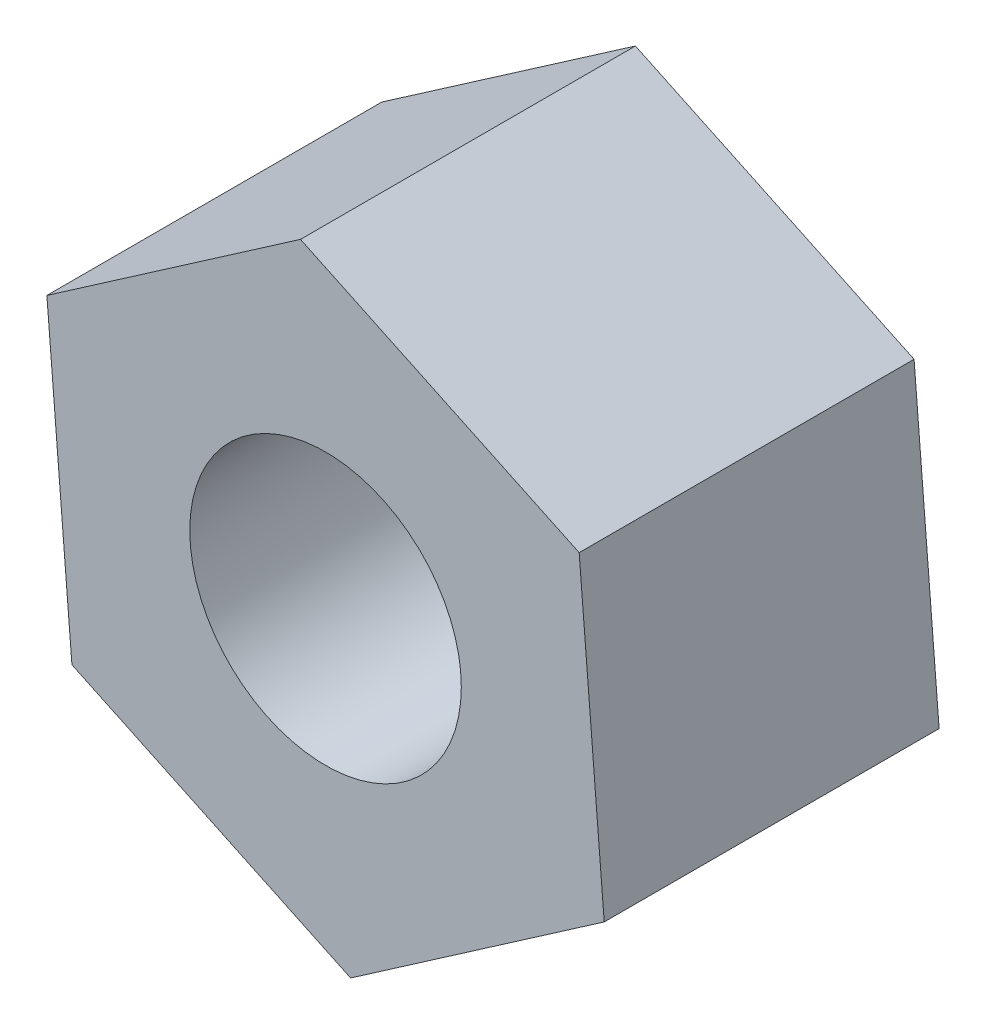
ISO-10303-21;
HEADER;
FILE_DESCRIPTION(('STEP AP214'),'2;1');
FILE_NAME('part.step','',(''),(''),'','','');
FILE_SCHEMA(('AUTOMOTIVE_DESIGN { 1 0 10303 214 1 1 1 1 }'));
ENDSEC;
DATA;
#1=APPLICATION_CONTEXT('core data for automotive mechanical design processes');
#2=APPLICATION_PROTOCOL_DEFINITION('international standard','automotive_design',2000,#1);
#3=PRODUCT_CONTEXT('',#1,'mechanical');
#4=PRODUCT('Part','Part','',(#3));
#5=PRODUCT_RELATED_PRODUCT_CATEGORY('part','',(#4));
#6=PRODUCT_DEFINITION_FORMATION('','',#4);
#7=PRODUCT_DEFINITION_CONTEXT('part definition',#1,'design');
#8=PRODUCT_DEFINITION('design','',#6,#7);
#9=PRODUCT_DEFINITION_SHAPE('','',#8);
#10=(LENGTH_UNIT() NAMED_UNIT(*) SI_UNIT(.MILLI.,.METRE.));
#11=(NAMED_UNIT(*) PLANE_ANGLE_UNIT() SI_UNIT($,.RADIAN.));
#12=(NAMED_UNIT(*) SI_UNIT($,.STERADIAN.) SOLID_ANGLE_UNIT());
#13=UNCERTAINTY_MEASURE_WITH_UNIT(LENGTH_MEASURE(1.E-05),#10,'distance_accuracy_value','');
#14=(GEOMETRIC_REPRESENTATION_CONTEXT(3) GLOBAL_UNCERTAINTY_ASSIGNED_CONTEXT((#13)) GLOBAL_UNIT_ASSIGNED_CONTEXT((#10,
#11,#12)) REPRESENTATION_CONTEXT('',''));
#15=CARTESIAN_POINT('',(0.,0.,0.));
#16=DIRECTION('',(0.,0.,1.));
#17=DIRECTION('',(1.,0.,0.));
#18=AXIS2_PLACEMENT_3D('',#15,#16,#17);
#19=CARTESIAN_POINT('',(0.,0.,3.7));
#20=DIRECTION('',(0.,0.,1.));
#21=DIRECTION('',(1.,0.,0.));
#22=AXIS2_PLACEMENT_3D('',#19,#20,#21);
#23=PLANE('',#22);
#24=DIRECTION('',(-0.903778262593263,0.428000995400599,0.));
#25=VECTOR('',#24,1.);
#26=CARTESIAN_POINT('',(2.80190297485983,1.93718172942163,3.7));
#27=LINE('',#26,#25);
#28=CARTESIAN_POINT('',(2.80190297485983,1.93718172942163,3.7));
#29=VERTEX_POINT('',#28);
#30=CARTESIAN_POINT('',(-0.276697101996294,3.39511001987862,3.7));
#31=VERTEX_POINT('',#30);
#32=EDGE_CURVE('E143',#29,#31,#27,.T.);
#33=ORIENTED_EDGE('',*,*,#32,.T.);
#34=DIRECTION('',(-0.822548866158576,-0.56869443709363,0.));
#35=VECTOR('',#34,1.);
#36=CARTESIAN_POINT('',(-0.276697101996294,3.39511001987862,3.7));
#37=LINE('',#36,#35);
#38=CARTESIAN_POINT('',(-3.07860007685612,1.45792829045698,3.7));
#39=VERTEX_POINT('',#38);
#40=EDGE_CURVE('E101',#31,#39,#37,.T.);
#41=ORIENTED_EDGE('',*,*,#40,.T.);
#42=DIRECTION('',(0.0812293964346863,-0.996695432494228,0.));
#43=VECTOR('',#42,1.);
#44=CARTESIAN_POINT('',(-3.07860007685612,1.45792829045698,3.7));
#45=LINE('',#44,#43);
#46=CARTESIAN_POINT('',(-2.80190297485983,-1.93718172942163,3.7));
#47=VERTEX_POINT('',#46);
#48=EDGE_CURVE('E114',#39,#47,#45,.T.);
#49=ORIENTED_EDGE('',*,*,#48,.T.);
#50=DIRECTION('',(0.903778262593263,-0.428000995400599,0.));
#51=VECTOR('',#50,1.);
#52=CARTESIAN_POINT('',(-2.80190297485983,-1.93718172942163,3.7));
#53=LINE('',#52,#51);
#54=CARTESIAN_POINT('',(0.276697101996293,-3.39511001987862,3.7));
#55=VERTEX_POINT('',#54);
#56=EDGE_CURVE('E108',#47,#55,#53,.T.);
#57=ORIENTED_EDGE('',*,*,#56,.T.);
#58=DIRECTION('',(0.822548866158576,0.56869443709363,0.));
#59=VECTOR('',#58,1.);
#60=CARTESIAN_POINT('',(0.276697101996293,-3.39511001987862,3.7));
#61=LINE('',#60,#59);
#62=CARTESIAN_POINT('',(3.07860007685612,-1.45792829045698,3.7));
#63=VERTEX_POINT('',#62);
#64=EDGE_CURVE('E112',#55,#63,#61,.T.);
#65=ORIENTED_EDGE('',*,*,#64,.T.);
#66=DIRECTION('',(-0.0812293964346861,0.996695432494228,0.));
#67=VECTOR('',#66,1.);
#68=CARTESIAN_POINT('',(3.07860007685612,-1.45792829045698,3.7));
#69=LINE('',#68,#67);
#70=EDGE_CURVE('E64',#63,#29,#69,.T.);
#71=ORIENTED_EDGE('',*,*,#70,.T.);
#72=EDGE_LOOP('',(#33,#41,#49,#57,#65,#71));
#73=FACE_BOUND('',#72,.T.);
#74=CARTESIAN_POINT('',(0.,0.,3.7));
#75=DIRECTION('',(0.,0.,1.));
#76=DIRECTION('',(1.,0.,0.));
#77=AXIS2_PLACEMENT_3D('',#74,#75,#76);
#78=CIRCLE('',#77,1.5);
#79=CARTESIAN_POINT('',(1.5,0.,3.7));
#80=VERTEX_POINT('',#79);
#81=EDGE_CURVE('E136',#80,#80,#78,.T.);
#82=ORIENTED_EDGE('',*,*,#81,.F.);
#83=EDGE_LOOP('',(#82));
#84=FACE_BOUND('',#83,.T.);
#85=ADVANCED_FACE('F47',(#73,#84),#23,.T.);
#86=CARTESIAN_POINT('',(0.,0.,0.));
#87=DIRECTION('',(0.,0.,1.));
#88=DIRECTION('',(1.,0.,0.));
#89=AXIS2_PLACEMENT_3D('',#86,#87,#88);
#90=PLANE('',#89);
#91=DIRECTION('',(-0.903778262593263,0.428000995400599,0.));
#92=VECTOR('',#91,1.);
#93=CARTESIAN_POINT('',(2.80190297485983,1.93718172942163,0.));
#94=LINE('',#93,#92);
#95=CARTESIAN_POINT('',(2.80190297485983,1.93718172942163,0.));
#96=VERTEX_POINT('',#95);
#97=CARTESIAN_POINT('',(-0.276697101996294,3.39511001987862,0.));
#98=VERTEX_POINT('',#97);
#99=EDGE_CURVE('E132',#96,#98,#94,.T.);
#100=ORIENTED_EDGE('',*,*,#99,.F.);
#101=DIRECTION('',(-0.0812293964346861,0.996695432494228,0.));
#102=VECTOR('',#101,1.);
#103=CARTESIAN_POINT('',(3.07860007685612,-1.45792829045698,0.));
#104=LINE('',#103,#102);
#105=CARTESIAN_POINT('',(3.07860007685612,-1.45792829045698,0.));
#106=VERTEX_POINT('',#105);
#107=EDGE_CURVE('E93',#106,#96,#104,.T.);
#108=ORIENTED_EDGE('',*,*,#107,.F.);
#109=DIRECTION('',(0.822548866158576,0.56869443709363,0.));
#110=VECTOR('',#109,1.);
#111=CARTESIAN_POINT('',(0.276697101996293,-3.39511001987862,0.));
#112=LINE('',#111,#110);
#113=CARTESIAN_POINT('',(0.276697101996293,-3.39511001987862,0.));
#114=VERTEX_POINT('',#113);
#115=EDGE_CURVE('E87',#114,#106,#112,.T.);
#116=ORIENTED_EDGE('',*,*,#115,.F.);
#117=DIRECTION('',(0.903778262593263,-0.428000995400599,0.));
#118=VECTOR('',#117,1.);
#119=CARTESIAN_POINT('',(-2.80190297485983,-1.93718172942163,0.));
#120=LINE('',#119,#118);
#121=CARTESIAN_POINT('',(-2.80190297485983,-1.93718172942163,0.));
#122=VERTEX_POINT('',#121);
#123=EDGE_CURVE('E122',#122,#114,#120,.T.);
#124=ORIENTED_EDGE('',*,*,#123,.F.);
#125=DIRECTION('',(0.0812293964346863,-0.996695432494228,0.));
#126=VECTOR('',#125,1.);
#127=CARTESIAN_POINT('',(-3.07860007685612,1.45792829045698,0.));
#128=LINE('',#127,#126);
#129=CARTESIAN_POINT('',(-3.07860007685612,1.45792829045698,0.));
#130=VERTEX_POINT('',#129);
#131=EDGE_CURVE('E138',#130,#122,#128,.T.);
#132=ORIENTED_EDGE('',*,*,#131,.F.);
#133=DIRECTION('',(-0.822548866158576,-0.56869443709363,0.));
#134=VECTOR('',#133,1.);
#135=CARTESIAN_POINT('',(-0.276697101996294,3.39511001987862,0.));
#136=LINE('',#135,#134);
#137=EDGE_CURVE('E135',#98,#130,#136,.T.);
#138=ORIENTED_EDGE('',*,*,#137,.F.);
#139=EDGE_LOOP('',(#100,#108,#116,#124,#132,#138));
#140=FACE_BOUND('',#139,.T.);
#141=CARTESIAN_POINT('',(0.,0.,0.));
#142=DIRECTION('',(0.,0.,1.));
#143=DIRECTION('',(1.,0.,0.));
#144=AXIS2_PLACEMENT_3D('',#141,#142,#143);
#145=CIRCLE('',#144,1.5);
#146=CARTESIAN_POINT('',(1.5,0.,0.));
#147=VERTEX_POINT('',#146);
#148=EDGE_CURVE('E246',#147,#147,#145,.T.);
#149=ORIENTED_EDGE('',*,*,#148,.T.);
#150=EDGE_LOOP('',(#149));
#151=FACE_BOUND('',#150,.T.);
#152=ADVANCED_FACE('F152',(#140,#151),#90,.F.);
#153=CARTESIAN_POINT('',(2.80190297485983,1.93718172942163,3.7));
#154=DIRECTION('',(-0.428000995400598,-0.903778262593263,0.));
#155=DIRECTION('',(0.903778262593263,-0.428000995400598,0.));
#156=AXIS2_PLACEMENT_3D('',#153,#154,#155);
#157=PLANE('',#156);
#158=ORIENTED_EDGE('',*,*,#99,.T.);
#159=DIRECTION('',(0.,0.,-1.));
#160=VECTOR('',#159,1.);
#161=CARTESIAN_POINT('',(-0.276697101996294,3.39511001987862,3.7));
#162=LINE('',#161,#160);
#163=EDGE_CURVE('E11',#31,#98,#162,.T.);
#164=ORIENTED_EDGE('',*,*,#163,.F.);
#165=ORIENTED_EDGE('',*,*,#32,.F.);
#166=DIRECTION('',(0.,0.,-1.));
#167=VECTOR('',#166,1.);
#168=CARTESIAN_POINT('',(2.80190297485983,1.93718172942163,3.7));
#169=LINE('',#168,#167);
#170=EDGE_CURVE('E128',#29,#96,#169,.T.);
#171=ORIENTED_EDGE('',*,*,#170,.T.);
#172=EDGE_LOOP('',(#158,#164,#165,#171));
#173=FACE_BOUND('',#172,.T.);
#174=ADVANCED_FACE('F49',(#173),#157,.F.);
#175=CARTESIAN_POINT('',(-0.276697101996294,3.39511001987862,3.7));
#176=DIRECTION('',(0.56869443709363,-0.822548866158577,0.));
#177=DIRECTION('',(0.822548866158576,0.56869443709363,0.));
#178=AXIS2_PLACEMENT_3D('',#175,#176,#177);
#179=PLANE('',#178);
#180=ORIENTED_EDGE('',*,*,#137,.T.);
#181=DIRECTION('',(0.,0.,-1.));
#182=VECTOR('',#181,1.);
#183=CARTESIAN_POINT('',(-3.07860007685612,1.45792829045698,3.7));
#184=LINE('',#183,#182);
#185=EDGE_CURVE('E56',#39,#130,#184,.T.);
#186=ORIENTED_EDGE('',*,*,#185,.F.);
#187=ORIENTED_EDGE('',*,*,#40,.F.);
#188=ORIENTED_EDGE('',*,*,#163,.T.);
#189=EDGE_LOOP('',(#180,#186,#187,#188));
#190=FACE_BOUND('',#189,.T.);
#191=ADVANCED_FACE('F179',(#190),#179,.F.);
#192=CARTESIAN_POINT('',(-3.07860007685612,1.45792829045698,3.7));
#193=DIRECTION('',(0.996695432494228,0.0812293964346863,0.));
#194=DIRECTION('',(-0.0812293964346863,0.996695432494228,0.));
#195=AXIS2_PLACEMENT_3D('',#192,#193,#194);
#196=PLANE('',#195);
#197=ORIENTED_EDGE('',*,*,#131,.T.);
#198=DIRECTION('',(0.,0.,-1.));
#199=VECTOR('',#198,1.);
#200=CARTESIAN_POINT('',(-2.80190297485983,-1.93718172942163,3.7));
#201=LINE('',#200,#199);
#202=EDGE_CURVE('E123',#47,#122,#201,.T.);
#203=ORIENTED_EDGE('',*,*,#202,.F.);
#204=ORIENTED_EDGE('',*,*,#48,.F.);
#205=ORIENTED_EDGE('',*,*,#185,.T.);
#206=EDGE_LOOP('',(#197,#203,#204,#205));
#207=FACE_BOUND('',#206,.T.);
#208=ADVANCED_FACE('F149',(#207),#196,.F.);
#209=CARTESIAN_POINT('',(-2.80190297485983,-1.93718172942163,3.7));
#210=DIRECTION('',(0.428000995400599,0.903778262593263,0.));
#211=DIRECTION('',(-0.903778262593263,0.428000995400599,0.));
#212=AXIS2_PLACEMENT_3D('',#209,#210,#211);
#213=PLANE('',#212);
#214=ORIENTED_EDGE('',*,*,#123,.T.);
#215=DIRECTION('',(0.,0.,-1.));
#216=VECTOR('',#215,1.);
#217=CARTESIAN_POINT('',(0.276697101996293,-3.39511001987862,3.7));
#218=LINE('',#217,#216);
#219=EDGE_CURVE('E119',#55,#114,#218,.T.);
#220=ORIENTED_EDGE('',*,*,#219,.F.);
#221=ORIENTED_EDGE('',*,*,#56,.F.);
#222=ORIENTED_EDGE('',*,*,#202,.T.);
#223=EDGE_LOOP('',(#214,#220,#221,#222));
#224=FACE_BOUND('',#223,.T.);
#225=ADVANCED_FACE('F120',(#224),#213,.F.);
#226=CARTESIAN_POINT('',(0.276697101996293,-3.39511001987862,3.7));
#227=DIRECTION('',(-0.56869443709363,0.822548866158576,0.));
#228=DIRECTION('',(-0.822548866158576,-0.56869443709363,0.));
#229=AXIS2_PLACEMENT_3D('',#226,#227,#228);
#230=PLANE('',#229);
#231=ORIENTED_EDGE('',*,*,#115,.T.);
#232=DIRECTION('',(0.,0.,-1.));
#233=VECTOR('',#232,1.);
#234=CARTESIAN_POINT('',(3.07860007685612,-1.45792829045698,3.7));
#235=LINE('',#234,#233);
#236=EDGE_CURVE('E124',#63,#106,#235,.T.);
#237=ORIENTED_EDGE('',*,*,#236,.F.);
#238=ORIENTED_EDGE('',*,*,#64,.F.);
#239=ORIENTED_EDGE('',*,*,#219,.T.);
#240=EDGE_LOOP('',(#231,#237,#238,#239));
#241=FACE_BOUND('',#240,.T.);
#242=ADVANCED_FACE('F126',(#241),#230,.F.);
#243=CARTESIAN_POINT('',(3.07860007685612,-1.45792829045698,3.7));
#244=DIRECTION('',(-0.996695432494228,-0.0812293964346861,0.));
#245=DIRECTION('',(0.0812293964346861,-0.996695432494228,0.));
#246=AXIS2_PLACEMENT_3D('',#243,#244,#245);
#247=PLANE('',#246);
#248=ORIENTED_EDGE('',*,*,#107,.T.);
#249=ORIENTED_EDGE('',*,*,#170,.F.);
#250=ORIENTED_EDGE('',*,*,#70,.F.);
#251=ORIENTED_EDGE('',*,*,#236,.T.);
#252=EDGE_LOOP('',(#248,#249,#250,#251));
#253=FACE_BOUND('',#252,.T.);
#254=ADVANCED_FACE('F157',(#253),#247,.F.);
#255=CARTESIAN_POINT('',(0.,0.,3.7));
#256=DIRECTION('',(0.,0.,-1.));
#257=DIRECTION('',(-1.,0.,0.));
#258=AXIS2_PLACEMENT_3D('',#255,#256,#257);
#259=CYLINDRICAL_SURFACE('',#258,1.5);
#260=ORIENTED_EDGE('',*,*,#81,.T.);
#261=EDGE_LOOP('',(#260));
#262=FACE_BOUND('',#261,.T.);
#263=ORIENTED_EDGE('',*,*,#148,.F.);
#264=EDGE_LOOP('',(#263));
#265=FACE_BOUND('',#264,.T.);
#266=ADVANCED_FACE('F159',(#262,#265),#259,.F.);
#267=CLOSED_SHELL('',(#85,#152,#174,#191,#208,#225,#242,#254,#266));
#268=MANIFOLD_SOLID_BREP('B2',#267);
#269=ADVANCED_BREP_SHAPE_REPRESENTATION('',(#18,#268),#14);
#270=SHAPE_DEFINITION_REPRESENTATION(#9,#269);
ENDSEC;
END-ISO-10303-21;
